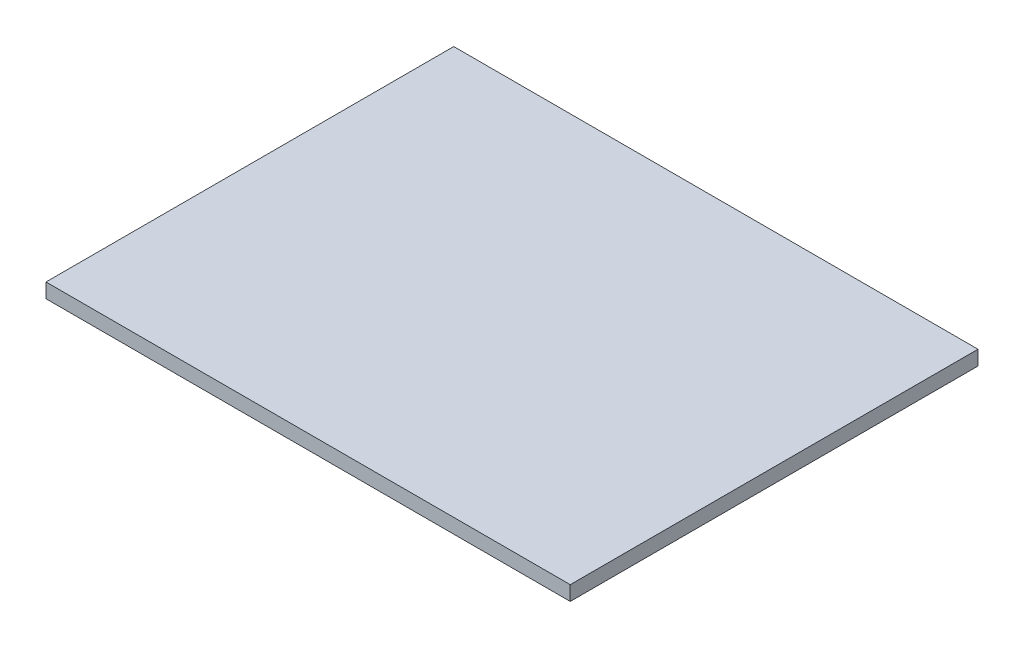
ISO-10303-21;
HEADER;
FILE_DESCRIPTION(('STEP AP214'),'2;1');
FILE_NAME('part.step','',(''),(''),'','','');
FILE_SCHEMA(('AUTOMOTIVE_DESIGN { 1 0 10303 214 1 1 1 1 }'));
ENDSEC;
DATA;
#1=APPLICATION_CONTEXT('core data for automotive mechanical design processes');
#2=APPLICATION_PROTOCOL_DEFINITION('international standard','automotive_design',2000,#1);
#3=PRODUCT_CONTEXT('',#1,'mechanical');
#4=PRODUCT('Part','Part','',(#3));
#5=PRODUCT_RELATED_PRODUCT_CATEGORY('part','',(#4));
#6=PRODUCT_DEFINITION_FORMATION('','',#4);
#7=PRODUCT_DEFINITION_CONTEXT('part definition',#1,'design');
#8=PRODUCT_DEFINITION('design','',#6,#7);
#9=PRODUCT_DEFINITION_SHAPE('','',#8);
#10=(LENGTH_UNIT() NAMED_UNIT(*) SI_UNIT(.MILLI.,.METRE.));
#11=(NAMED_UNIT(*) PLANE_ANGLE_UNIT() SI_UNIT($,.RADIAN.));
#12=(NAMED_UNIT(*) SI_UNIT($,.STERADIAN.) SOLID_ANGLE_UNIT());
#13=UNCERTAINTY_MEASURE_WITH_UNIT(LENGTH_MEASURE(1.E-05),#10,'distance_accuracy_value','');
#14=(GEOMETRIC_REPRESENTATION_CONTEXT(3) GLOBAL_UNCERTAINTY_ASSIGNED_CONTEXT((#13)) GLOBAL_UNIT_ASSIGNED_CONTEXT((#10,
#11,#12)) REPRESENTATION_CONTEXT('',''));
#15=CARTESIAN_POINT('',(0.,0.,0.));
#16=DIRECTION('',(0.,0.,1.));
#17=DIRECTION('',(1.,0.,0.));
#18=AXIS2_PLACEMENT_3D('',#15,#16,#17);
#19=CARTESIAN_POINT('',(90.,5.,70.));
#20=DIRECTION('',(-1.,0.,0.));
#21=DIRECTION('',(0.,0.,1.));
#22=AXIS2_PLACEMENT_3D('',#19,#20,#21);
#23=PLANE('',#22);
#24=DIRECTION('',(0.,0.,-1.));
#25=VECTOR('',#24,1.);
#26=CARTESIAN_POINT('',(90.,0.,70.));
#27=LINE('',#26,#25);
#28=CARTESIAN_POINT('',(90.,0.,70.));
#29=VERTEX_POINT('',#28);
#30=CARTESIAN_POINT('',(90.,0.,-70.));
#31=VERTEX_POINT('',#30);
#32=EDGE_CURVE('E96',#29,#31,#27,.T.);
#33=ORIENTED_EDGE('',*,*,#32,.T.);
#34=DIRECTION('',(0.,-1.,0.));
#35=VECTOR('',#34,1.);
#36=CARTESIAN_POINT('',(90.,5.,-70.));
#37=LINE('',#36,#35);
#38=CARTESIAN_POINT('',(90.,5.,-70.));
#39=VERTEX_POINT('',#38);
#40=EDGE_CURVE('E11',#39,#31,#37,.T.);
#41=ORIENTED_EDGE('',*,*,#40,.F.);
#42=DIRECTION('',(0.,0.,-1.));
#43=VECTOR('',#42,1.);
#44=CARTESIAN_POINT('',(90.,5.,70.));
#45=LINE('',#44,#43);
#46=CARTESIAN_POINT('',(90.,5.,70.));
#47=VERTEX_POINT('',#46);
#48=EDGE_CURVE('E84',#47,#39,#45,.T.);
#49=ORIENTED_EDGE('',*,*,#48,.F.);
#50=DIRECTION('',(0.,-1.,0.));
#51=VECTOR('',#50,1.);
#52=CARTESIAN_POINT('',(90.,5.,70.));
#53=LINE('',#52,#51);
#54=EDGE_CURVE('E92',#47,#29,#53,.T.);
#55=ORIENTED_EDGE('',*,*,#54,.T.);
#56=EDGE_LOOP('',(#33,#41,#49,#55));
#57=FACE_BOUND('',#56,.T.);
#58=ADVANCED_FACE('F33',(#57),#23,.F.);
#59=CARTESIAN_POINT('',(-90.,5.,-70.));
#60=DIRECTION('',(0.,0.,1.));
#61=DIRECTION('',(1.,0.,0.));
#62=AXIS2_PLACEMENT_3D('',#59,#60,#61);
#63=PLANE('',#62);
#64=DIRECTION('',(-1.,0.,0.));
#65=VECTOR('',#64,1.);
#66=CARTESIAN_POINT('',(-90.,0.,-70.));
#67=LINE('',#66,#65);
#68=CARTESIAN_POINT('',(-90.,0.,-70.));
#69=VERTEX_POINT('',#68);
#70=EDGE_CURVE('E88',#31,#69,#67,.T.);
#71=ORIENTED_EDGE('',*,*,#70,.T.);
#72=DIRECTION('',(0.,-1.,0.));
#73=VECTOR('',#72,1.);
#74=CARTESIAN_POINT('',(-90.,5.,-70.));
#75=LINE('',#74,#73);
#76=CARTESIAN_POINT('',(-90.,5.,-70.));
#77=VERTEX_POINT('',#76);
#78=EDGE_CURVE('E41',#77,#69,#75,.T.);
#79=ORIENTED_EDGE('',*,*,#78,.F.);
#80=DIRECTION('',(-1.,0.,0.));
#81=VECTOR('',#80,1.);
#82=CARTESIAN_POINT('',(-90.,5.,-70.));
#83=LINE('',#82,#81);
#84=EDGE_CURVE('E79',#39,#77,#83,.T.);
#85=ORIENTED_EDGE('',*,*,#84,.F.);
#86=ORIENTED_EDGE('',*,*,#40,.T.);
#87=EDGE_LOOP('',(#71,#79,#85,#86));
#88=FACE_BOUND('',#87,.T.);
#89=ADVANCED_FACE('F87',(#88),#63,.F.);
#90=CARTESIAN_POINT('',(-90.,5.,70.));
#91=DIRECTION('',(1.,0.,0.));
#92=DIRECTION('',(0.,0.,-1.));
#93=AXIS2_PLACEMENT_3D('',#90,#91,#92);
#94=PLANE('',#93);
#95=DIRECTION('',(0.,0.,1.));
#96=VECTOR('',#95,1.);
#97=CARTESIAN_POINT('',(-90.,0.,70.));
#98=LINE('',#97,#96);
#99=CARTESIAN_POINT('',(-90.,0.,70.));
#100=VERTEX_POINT('',#99);
#101=EDGE_CURVE('E66',#69,#100,#98,.T.);
#102=ORIENTED_EDGE('',*,*,#101,.T.);
#103=DIRECTION('',(0.,-1.,0.));
#104=VECTOR('',#103,1.);
#105=CARTESIAN_POINT('',(-90.,5.,70.));
#106=LINE('',#105,#104);
#107=CARTESIAN_POINT('',(-90.,5.,70.));
#108=VERTEX_POINT('',#107);
#109=EDGE_CURVE('E89',#108,#100,#106,.T.);
#110=ORIENTED_EDGE('',*,*,#109,.F.);
#111=DIRECTION('',(0.,0.,1.));
#112=VECTOR('',#111,1.);
#113=CARTESIAN_POINT('',(-90.,5.,70.));
#114=LINE('',#113,#112);
#115=EDGE_CURVE('E82',#77,#108,#114,.T.);
#116=ORIENTED_EDGE('',*,*,#115,.F.);
#117=ORIENTED_EDGE('',*,*,#78,.T.);
#118=EDGE_LOOP('',(#102,#110,#116,#117));
#119=FACE_BOUND('',#118,.T.);
#120=ADVANCED_FACE('F90',(#119),#94,.F.);
#121=CARTESIAN_POINT('',(-90.,5.,70.));
#122=DIRECTION('',(0.,0.,-1.));
#123=DIRECTION('',(-1.,0.,0.));
#124=AXIS2_PLACEMENT_3D('',#121,#122,#123);
#125=PLANE('',#124);
#126=DIRECTION('',(1.,0.,0.));
#127=VECTOR('',#126,1.);
#128=CARTESIAN_POINT('',(-90.,0.,70.));
#129=LINE('',#128,#127);
#130=EDGE_CURVE('E72',#100,#29,#129,.T.);
#131=ORIENTED_EDGE('',*,*,#130,.T.);
#132=ORIENTED_EDGE('',*,*,#54,.F.);
#133=DIRECTION('',(1.,0.,0.));
#134=VECTOR('',#133,1.);
#135=CARTESIAN_POINT('',(-90.,5.,70.));
#136=LINE('',#135,#134);
#137=EDGE_CURVE('E49',#108,#47,#136,.T.);
#138=ORIENTED_EDGE('',*,*,#137,.F.);
#139=ORIENTED_EDGE('',*,*,#109,.T.);
#140=EDGE_LOOP('',(#131,#132,#138,#139));
#141=FACE_BOUND('',#140,.T.);
#142=ADVANCED_FACE('F103',(#141),#125,.F.);
#143=CARTESIAN_POINT('',(0.,5.,0.));
#144=DIRECTION('',(0.,-1.,0.));
#145=DIRECTION('',(0.,0.,-1.));
#146=AXIS2_PLACEMENT_3D('',#143,#144,#145);
#147=PLANE('',#146);
#148=ORIENTED_EDGE('',*,*,#48,.T.);
#149=ORIENTED_EDGE('',*,*,#84,.T.);
#150=ORIENTED_EDGE('',*,*,#115,.T.);
#151=ORIENTED_EDGE('',*,*,#137,.T.);
#152=EDGE_LOOP('',(#148,#149,#150,#151));
#153=FACE_BOUND('',#152,.T.);
#154=ADVANCED_FACE('F80',(#153),#147,.F.);
#155=CARTESIAN_POINT('',(0.,0.,0.));
#156=DIRECTION('',(0.,-1.,0.));
#157=DIRECTION('',(0.,0.,-1.));
#158=AXIS2_PLACEMENT_3D('',#155,#156,#157);
#159=PLANE('',#158);
#160=ORIENTED_EDGE('',*,*,#32,.F.);
#161=ORIENTED_EDGE('',*,*,#130,.F.);
#162=ORIENTED_EDGE('',*,*,#101,.F.);
#163=ORIENTED_EDGE('',*,*,#70,.F.);
#164=EDGE_LOOP('',(#160,#161,#162,#163));
#165=FACE_BOUND('',#164,.T.);
#166=ADVANCED_FACE('F106',(#165),#159,.T.);
#167=CLOSED_SHELL('',(#58,#89,#120,#142,#154,#166));
#168=MANIFOLD_SOLID_BREP('B2',#167);
#169=ADVANCED_BREP_SHAPE_REPRESENTATION('',(#18,#168),#14);
#170=SHAPE_DEFINITION_REPRESENTATION(#9,#169);
ENDSEC;
END-ISO-10303-21;
